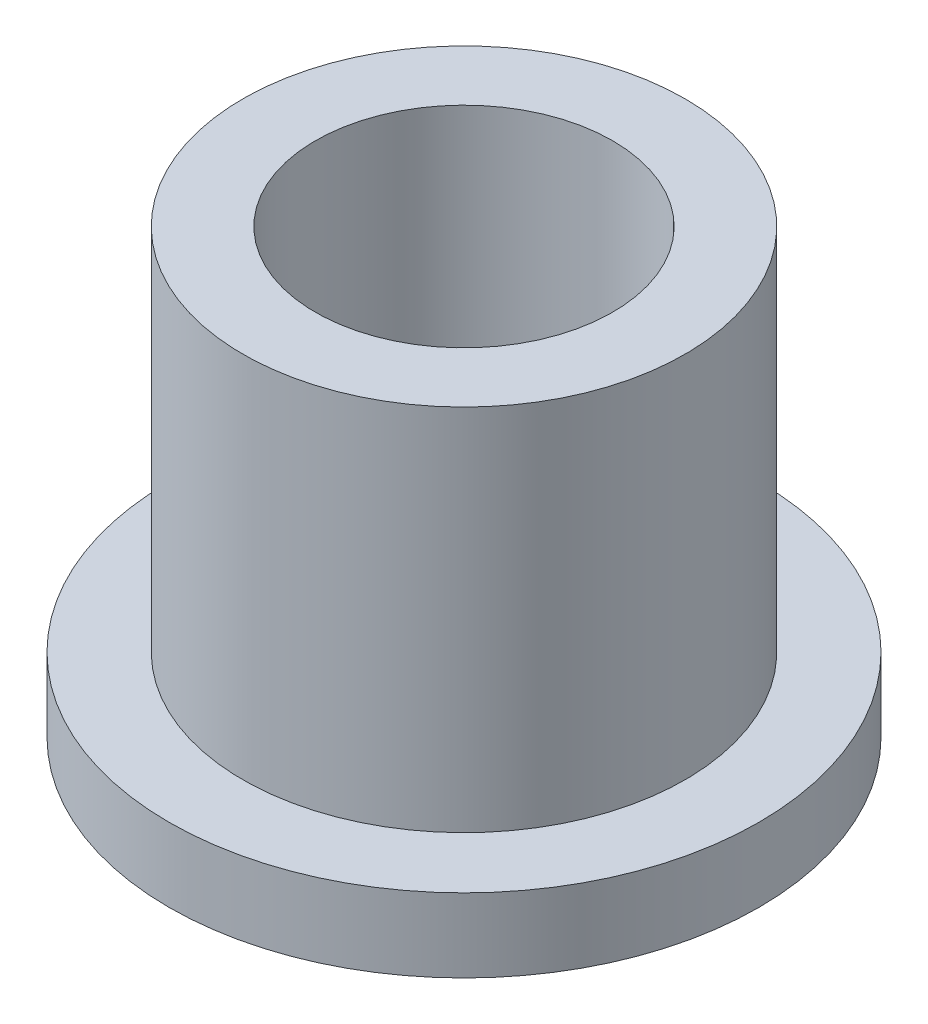
ISO-10303-21;
HEADER;
FILE_DESCRIPTION(('STEP AP214'),'2;1');
FILE_NAME('part.step','',(''),(''),'','','');
FILE_SCHEMA(('AUTOMOTIVE_DESIGN { 1 0 10303 214 1 1 1 1 }'));
ENDSEC;
DATA;
#1=APPLICATION_CONTEXT('core data for automotive mechanical design processes');
#2=APPLICATION_PROTOCOL_DEFINITION('international standard','automotive_design',2000,#1);
#3=PRODUCT_CONTEXT('',#1,'mechanical');
#4=PRODUCT('Part','Part','',(#3));
#5=PRODUCT_RELATED_PRODUCT_CATEGORY('part','',(#4));
#6=PRODUCT_DEFINITION_FORMATION('','',#4);
#7=PRODUCT_DEFINITION_CONTEXT('part definition',#1,'design');
#8=PRODUCT_DEFINITION('design','',#6,#7);
#9=PRODUCT_DEFINITION_SHAPE('','',#8);
#10=(LENGTH_UNIT() NAMED_UNIT(*) SI_UNIT(.MILLI.,.METRE.));
#11=(NAMED_UNIT(*) PLANE_ANGLE_UNIT() SI_UNIT($,.RADIAN.));
#12=(NAMED_UNIT(*) SI_UNIT($,.STERADIAN.) SOLID_ANGLE_UNIT());
#13=UNCERTAINTY_MEASURE_WITH_UNIT(LENGTH_MEASURE(1.E-05),#10,'distance_accuracy_value','');
#14=(GEOMETRIC_REPRESENTATION_CONTEXT(3) GLOBAL_UNCERTAINTY_ASSIGNED_CONTEXT((#13)) GLOBAL_UNIT_ASSIGNED_CONTEXT((#10,
#11,#12)) REPRESENTATION_CONTEXT('',''));
#15=CARTESIAN_POINT('',(0.,0.,0.));
#16=DIRECTION('',(0.,0.,1.));
#17=DIRECTION('',(1.,0.,0.));
#18=AXIS2_PLACEMENT_3D('',#15,#16,#17);
#19=CARTESIAN_POINT('',(0.,19.05,0.));
#20=DIRECTION('',(0.,1.,0.));
#21=DIRECTION('',(0.,0.,0.999999999999999));
#22=AXIS2_PLACEMENT_3D('',#19,#20,#21);
#23=PLANE('',#22);
#24=CARTESIAN_POINT('',(0.,19.05,0.));
#25=DIRECTION('',(0.,1.,0.));
#26=DIRECTION('',(0.,0.,0.999999999999999));
#27=AXIS2_PLACEMENT_3D('',#24,#25,#26);
#28=CIRCLE('',#27,9.525);
#29=CARTESIAN_POINT('',(0.,19.05,-9.52500000000006));
#30=VERTEX_POINT('',#29);
#31=EDGE_CURVE('E12',#30,#30,#28,.T.);
#32=ORIENTED_EDGE('',*,*,#31,.T.);
#33=EDGE_LOOP('',(#32));
#34=FACE_BOUND('',#33,.T.);
#35=CARTESIAN_POINT('',(0.,19.05,0.));
#36=DIRECTION('',(0.,1.,0.));
#37=DIRECTION('',(0.,0.,0.999999999999999));
#38=AXIS2_PLACEMENT_3D('',#35,#36,#37);
#39=CIRCLE('',#38,6.4008);
#40=CARTESIAN_POINT('',(0.,19.05,-6.40080000000007));
#41=VERTEX_POINT('',#40);
#42=EDGE_CURVE('E56',#41,#41,#39,.T.);
#43=ORIENTED_EDGE('',*,*,#42,.F.);
#44=EDGE_LOOP('',(#43));
#45=FACE_BOUND('',#44,.T.);
#46=ADVANCED_FACE('F49',(#34,#45),#23,.T.);
#47=CARTESIAN_POINT('',(0.,0.,0.));
#48=DIRECTION('',(0.,1.,0.));
#49=DIRECTION('',(0.,0.,0.999999999999999));
#50=AXIS2_PLACEMENT_3D('',#47,#48,#49);
#51=PLANE('',#50);
#52=CARTESIAN_POINT('',(0.,0.,0.));
#53=DIRECTION('',(0.,1.,0.));
#54=DIRECTION('',(0.,0.,0.999999999999999));
#55=AXIS2_PLACEMENT_3D('',#52,#53,#54);
#56=CIRCLE('',#55,6.4008);
#57=CARTESIAN_POINT('',(0.,0.,-6.40080000000007));
#58=VERTEX_POINT('',#57);
#59=EDGE_CURVE('E60',#58,#58,#56,.T.);
#60=ORIENTED_EDGE('',*,*,#59,.T.);
#61=EDGE_LOOP('',(#60));
#62=FACE_BOUND('',#61,.T.);
#63=CARTESIAN_POINT('',(0.,0.,0.));
#64=DIRECTION('',(0.,1.,0.));
#65=DIRECTION('',(0.,0.,0.999999999999999));
#66=AXIS2_PLACEMENT_3D('',#63,#64,#65);
#67=CIRCLE('',#66,12.7);
#68=CARTESIAN_POINT('',(0.,0.,12.7));
#69=VERTEX_POINT('',#68);
#70=EDGE_CURVE('E67',#69,#69,#67,.T.);
#71=ORIENTED_EDGE('',*,*,#70,.F.);
#72=EDGE_LOOP('',(#71));
#73=FACE_BOUND('',#72,.T.);
#74=ADVANCED_FACE('F92',(#62,#73),#51,.F.);
#75=CARTESIAN_POINT('',(0.,19.05,0.));
#76=DIRECTION('',(0.,-1.,0.));
#77=DIRECTION('',(0.,0.,-0.999999999999999));
#78=AXIS2_PLACEMENT_3D('',#75,#76,#77);
#79=CYLINDRICAL_SURFACE('',#78,9.525);
#80=CARTESIAN_POINT('',(0.,3.175,0.));
#81=DIRECTION('',(0.,1.,0.));
#82=DIRECTION('',(0.,0.,0.999999999999999));
#83=AXIS2_PLACEMENT_3D('',#80,#81,#82);
#84=CIRCLE('',#83,9.525);
#85=CARTESIAN_POINT('',(0.,3.17499999999999,-9.52500000000006));
#86=VERTEX_POINT('',#85);
#87=EDGE_CURVE('E70',#86,#86,#84,.T.);
#88=CARTESIAN_POINT('',(0.,3.17499999999999,-9.52500000000006));
#89=CARTESIAN_POINT('',(0.,3.34036458333333,-9.52500000000006));
#90=CARTESIAN_POINT('',(0.,3.50572916666666,-9.52500000000006));
#91=CARTESIAN_POINT('',(0.,3.83645833333333,-9.52500000000006));
#92=CARTESIAN_POINT('',(0.,4.00182291666666,-9.52500000000006));
#93=CARTESIAN_POINT('',(0.,4.33255208333333,-9.52500000000006));
#94=CARTESIAN_POINT('',(0.,4.49791666666666,-9.52500000000006));
#95=CARTESIAN_POINT('',(0.,4.82864583333333,-9.52500000000006));
#96=CARTESIAN_POINT('',(0.,4.99401041666666,-9.52500000000006));
#97=CARTESIAN_POINT('',(0.,5.32473958333333,-9.52500000000006));
#98=CARTESIAN_POINT('',(0.,5.49010416666666,-9.52500000000006));
#99=CARTESIAN_POINT('',(0.,5.82083333333333,-9.52500000000006));
#100=CARTESIAN_POINT('',(0.,5.98619791666666,-9.52500000000006));
#101=CARTESIAN_POINT('',(0.,6.31692708333333,-9.52500000000006));
#102=CARTESIAN_POINT('',(0.,6.48229166666666,-9.52500000000006));
#103=CARTESIAN_POINT('',(0.,6.81302083333333,-9.52500000000006));
#104=CARTESIAN_POINT('',(0.,6.97838541666666,-9.52500000000006));
#105=CARTESIAN_POINT('',(0.,7.30911458333333,-9.52500000000006));
#106=CARTESIAN_POINT('',(0.,7.47447916666667,-9.52500000000006));
#107=CARTESIAN_POINT('',(0.,7.80520833333333,-9.52500000000006));
#108=CARTESIAN_POINT('',(0.,7.97057291666667,-9.52500000000006));
#109=CARTESIAN_POINT('',(0.,8.30130208333333,-9.52500000000006));
#110=CARTESIAN_POINT('',(0.,8.46666666666667,-9.52500000000006));
#111=CARTESIAN_POINT('',(0.,8.79739583333333,-9.52500000000006));
#112=CARTESIAN_POINT('',(0.,8.96276041666667,-9.52500000000006));
#113=CARTESIAN_POINT('',(0.,9.29348958333333,-9.52500000000006));
#114=CARTESIAN_POINT('',(0.,9.45885416666667,-9.52500000000006));
#115=CARTESIAN_POINT('',(0.,9.78958333333333,-9.52500000000006));
#116=CARTESIAN_POINT('',(0.,9.95494791666667,-9.52500000000006));
#117=CARTESIAN_POINT('',(0.,10.2856770833333,-9.52500000000006));
#118=CARTESIAN_POINT('',(0.,10.4510416666667,-9.52500000000006));
#119=CARTESIAN_POINT('',(0.,10.7817708333333,-9.52500000000006));
#120=CARTESIAN_POINT('',(0.,10.9471354166667,-9.52500000000006));
#121=CARTESIAN_POINT('',(0.,11.2778645833333,-9.52500000000006));
#122=CARTESIAN_POINT('',(0.,11.4432291666667,-9.52500000000006));
#123=CARTESIAN_POINT('',(0.,11.7739583333333,-9.52500000000006));
#124=CARTESIAN_POINT('',(0.,11.9393229166667,-9.52500000000006));
#125=CARTESIAN_POINT('',(0.,12.2700520833333,-9.52500000000006));
#126=CARTESIAN_POINT('',(0.,12.4354166666667,-9.52500000000006));
#127=CARTESIAN_POINT('',(0.,12.7661458333333,-9.52500000000006));
#128=CARTESIAN_POINT('',(0.,12.9315104166667,-9.52500000000006));
#129=CARTESIAN_POINT('',(0.,13.2622395833333,-9.52500000000006));
#130=CARTESIAN_POINT('',(0.,13.4276041666667,-9.52500000000006));
#131=CARTESIAN_POINT('',(0.,13.7583333333333,-9.52500000000006));
#132=CARTESIAN_POINT('',(0.,13.9236979166667,-9.52500000000006));
#133=CARTESIAN_POINT('',(0.,14.2544270833333,-9.52500000000006));
#134=CARTESIAN_POINT('',(0.,14.4197916666667,-9.52500000000006));
#135=CARTESIAN_POINT('',(0.,14.7505208333333,-9.52500000000006));
#136=CARTESIAN_POINT('',(0.,14.9158854166667,-9.52500000000006));
#137=CARTESIAN_POINT('',(0.,15.2466145833333,-9.52500000000006));
#138=CARTESIAN_POINT('',(0.,15.4119791666667,-9.52500000000006));
#139=CARTESIAN_POINT('',(0.,15.7427083333333,-9.52500000000006));
#140=CARTESIAN_POINT('',(0.,15.9080729166667,-9.52500000000006));
#141=CARTESIAN_POINT('',(0.,16.2388020833333,-9.52500000000006));
#142=CARTESIAN_POINT('',(0.,16.4041666666667,-9.52500000000006));
#143=CARTESIAN_POINT('',(0.,16.7348958333333,-9.52500000000006));
#144=CARTESIAN_POINT('',(0.,16.9002604166667,-9.52500000000006));
#145=CARTESIAN_POINT('',(0.,17.2309895833333,-9.52500000000006));
#146=CARTESIAN_POINT('',(0.,17.3963541666667,-9.52500000000006));
#147=CARTESIAN_POINT('',(0.,17.7270833333333,-9.52500000000006));
#148=CARTESIAN_POINT('',(0.,17.8924479166667,-9.52500000000006));
#149=CARTESIAN_POINT('',(0.,18.2231770833333,-9.52500000000006));
#150=CARTESIAN_POINT('',(0.,18.3885416666667,-9.52500000000006));
#151=CARTESIAN_POINT('',(0.,18.7192708333333,-9.52500000000006));
#152=CARTESIAN_POINT('',(0.,18.8846354166667,-9.52500000000006));
#153=CARTESIAN_POINT('',(0.,19.05,-9.52500000000006));
#154=B_SPLINE_CURVE_WITH_KNOTS('',3,(#88,#89,#90,#91,#92,#93,#94,#95,#96,#97,#98,#99,#100,#101,
#102,#103,#104,#105,#106,#107,#108,#109,#110,#111,#112,#113,#114,#115,#116,#117,#118,#119,#120,
#121,#122,#123,#124,#125,#126,#127,#128,#129,#130,#131,#132,#133,#134,#135,#136,#137,#138,#139,
#140,#141,#142,#143,#144,#145,#146,#147,#148,#149,#150,#151,#152,#153),.UNSPECIFIED.,.F.,.F.,(4,
2,2,2,2,2,2,2,2,2,2,2,2,2,2,2,2,2,2,2,2,2,2,2,2,2,2,2,2,2,2,2,4),(0.,0.496093749999999,
0.9921875,1.48828125,1.984375,2.48046875,2.9765625,3.47265625,3.96875,4.46484375,
4.96093750000001,5.45703125000001,5.95312500000001,6.44921875000001,6.94531250000001,
7.44140625000001,7.93750000000001,8.43359375000001,8.92968750000001,9.42578125000001,
9.92187500000001,10.41796875,10.9140625,11.41015625,11.90625,12.40234375,12.8984375,13.39453125,
13.890625,14.38671875,14.8828125,15.37890625,15.875),.UNSPECIFIED.);
#155=EDGE_CURVE('BSEAM51',#86,#30,#154,.T.);
#156=ORIENTED_EDGE('',*,*,#87,.T.);
#157=ORIENTED_EDGE('',*,*,#31,.F.);
#158=ORIENTED_EDGE('',*,*,#155,.T.);
#159=ORIENTED_EDGE('',*,*,#155,.F.);
#160=EDGE_LOOP('',(#156,#158,#157,#159));
#161=FACE_BOUND('',#160,.T.);
#162=ADVANCED_FACE('F51',(#161),#79,.T.);
#163=CARTESIAN_POINT('',(0.,19.05,0.));
#164=DIRECTION('',(0.,-1.,0.));
#165=DIRECTION('',(0.,0.,-0.999999999999999));
#166=AXIS2_PLACEMENT_3D('',#163,#164,#165);
#167=CYLINDRICAL_SURFACE('',#166,6.4008);
#168=CARTESIAN_POINT('',(0.,19.05,-6.40080000000007));
#169=CARTESIAN_POINT('',(0.,18.8515625,-6.40080000000007));
#170=CARTESIAN_POINT('',(0.,18.653125,-6.40080000000007));
#171=CARTESIAN_POINT('',(0.,18.25625,-6.40080000000007));
#172=CARTESIAN_POINT('',(0.,18.0578125,-6.40080000000007));
#173=CARTESIAN_POINT('',(0.,17.6609375,-6.40080000000007));
#174=CARTESIAN_POINT('',(0.,17.4625,-6.40080000000007));
#175=CARTESIAN_POINT('',(0.,17.065625,-6.40080000000007));
#176=CARTESIAN_POINT('',(0.,16.8671875,-6.40080000000007));
#177=CARTESIAN_POINT('',(0.,16.4703125,-6.40080000000007));
#178=CARTESIAN_POINT('',(0.,16.271875,-6.40080000000007));
#179=CARTESIAN_POINT('',(0.,15.875,-6.40080000000007));
#180=CARTESIAN_POINT('',(0.,15.6765625,-6.40080000000007));
#181=CARTESIAN_POINT('',(0.,15.2796875,-6.40080000000007));
#182=CARTESIAN_POINT('',(0.,15.08125,-6.40080000000007));
#183=CARTESIAN_POINT('',(0.,14.684375,-6.40080000000007));
#184=CARTESIAN_POINT('',(0.,14.4859375,-6.40080000000007));
#185=CARTESIAN_POINT('',(0.,14.0890625,-6.40080000000007));
#186=CARTESIAN_POINT('',(0.,13.890625,-6.40080000000007));
#187=CARTESIAN_POINT('',(0.,13.49375,-6.40080000000007));
#188=CARTESIAN_POINT('',(0.,13.2953125,-6.40080000000007));
#189=CARTESIAN_POINT('',(0.,12.8984375,-6.40080000000007));
#190=CARTESIAN_POINT('',(0.,12.7,-6.40080000000007));
#191=CARTESIAN_POINT('',(0.,12.303125,-6.40080000000007));
#192=CARTESIAN_POINT('',(0.,12.1046875,-6.40080000000007));
#193=CARTESIAN_POINT('',(0.,11.7078125,-6.40080000000007));
#194=CARTESIAN_POINT('',(0.,11.509375,-6.40080000000007));
#195=CARTESIAN_POINT('',(0.,11.1125,-6.40080000000007));
#196=CARTESIAN_POINT('',(0.,10.9140625,-6.40080000000007));
#197=CARTESIAN_POINT('',(0.,10.5171875,-6.40080000000007));
#198=CARTESIAN_POINT('',(0.,10.31875,-6.40080000000007));
#199=CARTESIAN_POINT('',(0.,9.921875,-6.40080000000007));
#200=CARTESIAN_POINT('',(0.,9.7234375,-6.40080000000007));
#201=CARTESIAN_POINT('',(0.,9.3265625,-6.40080000000007));
#202=CARTESIAN_POINT('',(0.,9.128125,-6.40080000000007));
#203=CARTESIAN_POINT('',(0.,8.73125,-6.40080000000007));
#204=CARTESIAN_POINT('',(0.,8.5328125,-6.40080000000007));
#205=CARTESIAN_POINT('',(0.,8.1359375,-6.40080000000007));
#206=CARTESIAN_POINT('',(0.,7.9375,-6.40080000000007));
#207=CARTESIAN_POINT('',(0.,7.540625,-6.40080000000007));
#208=CARTESIAN_POINT('',(0.,7.3421875,-6.40080000000007));
#209=CARTESIAN_POINT('',(0.,6.9453125,-6.40080000000007));
#210=CARTESIAN_POINT('',(0.,6.746875,-6.40080000000007));
#211=CARTESIAN_POINT('',(0.,6.35,-6.40080000000007));
#212=CARTESIAN_POINT('',(0.,6.1515625,-6.40080000000007));
#213=CARTESIAN_POINT('',(0.,5.7546875,-6.40080000000007));
#214=CARTESIAN_POINT('',(0.,5.55625,-6.40080000000007));
#215=CARTESIAN_POINT('',(0.,5.159375,-6.40080000000007));
#216=CARTESIAN_POINT('',(0.,4.9609375,-6.40080000000007));
#217=CARTESIAN_POINT('',(0.,4.5640625,-6.40080000000007));
#218=CARTESIAN_POINT('',(0.,4.365625,-6.40080000000007));
#219=CARTESIAN_POINT('',(0.,3.96875,-6.40080000000007));
#220=CARTESIAN_POINT('',(0.,3.7703125,-6.40080000000007));
#221=CARTESIAN_POINT('',(0.,3.3734375,-6.40080000000007));
#222=CARTESIAN_POINT('',(0.,3.175,-6.40080000000007));
#223=CARTESIAN_POINT('',(0.,2.778125,-6.40080000000007));
#224=CARTESIAN_POINT('',(0.,2.5796875,-6.40080000000007));
#225=CARTESIAN_POINT('',(0.,2.1828125,-6.40080000000007));
#226=CARTESIAN_POINT('',(0.,1.984375,-6.40080000000007));
#227=CARTESIAN_POINT('',(0.,1.5875,-6.40080000000007));
#228=CARTESIAN_POINT('',(0.,1.3890625,-6.40080000000007));
#229=CARTESIAN_POINT('',(0.,0.992187499999997,-6.40080000000007));
#230=CARTESIAN_POINT('',(0.,0.793749999999997,-6.40080000000007));
#231=CARTESIAN_POINT('',(0.,0.396874999999997,-6.40080000000007));
#232=CARTESIAN_POINT('',(0.,0.198437499999997,-6.40080000000007));
#233=CARTESIAN_POINT('',(0.,0.,-6.40080000000007));
#234=B_SPLINE_CURVE_WITH_KNOTS('',3,(#168,#169,#170,#171,#172,#173,#174,#175,#176,#177,#178,
#179,#180,#181,#182,#183,#184,#185,#186,#187,#188,#189,#190,#191,#192,#193,#194,#195,#196,#197,
#198,#199,#200,#201,#202,#203,#204,#205,#206,#207,#208,#209,#210,#211,#212,#213,#214,#215,#216,
#217,#218,#219,#220,#221,#222,#223,#224,#225,#226,#227,#228,#229,#230,#231,#232,#233),
.UNSPECIFIED.,.F.,.F.,(4,2,2,2,2,2,2,2,2,2,2,2,2,2,2,2,2,2,2,2,2,2,2,2,2,2,2,2,2,2,2,2,4),(0.,
0.595312499999997,1.190625,1.7859375,2.38125,2.9765625,3.571875,4.1671875,4.7625,5.3578125,
5.953125,6.5484375,7.14375,7.7390625,8.334375,8.9296875,9.525,10.1203125,10.715625,11.3109375,
11.90625,12.5015625,13.096875,13.6921875,14.2875,14.8828125,15.478125,16.0734375,16.66875,
17.2640625,17.859375,18.4546875,19.05),.UNSPECIFIED.);
#235=EDGE_CURVE('BSEAM81',#41,#58,#234,.T.);
#236=ORIENTED_EDGE('',*,*,#42,.T.);
#237=ORIENTED_EDGE('',*,*,#59,.F.);
#238=ORIENTED_EDGE('',*,*,#235,.T.);
#239=ORIENTED_EDGE('',*,*,#235,.F.);
#240=EDGE_LOOP('',(#236,#238,#237,#239));
#241=FACE_BOUND('',#240,.T.);
#242=ADVANCED_FACE('F81',(#241),#167,.F.);
#243=CARTESIAN_POINT('',(0.,3.175,0.));
#244=DIRECTION('',(0.,1.,0.));
#245=DIRECTION('',(0.,0.,0.999999999999999));
#246=AXIS2_PLACEMENT_3D('',#243,#244,#245);
#247=PLANE('',#246);
#248=CARTESIAN_POINT('',(0.,3.175,0.));
#249=DIRECTION('',(0.,1.,0.));
#250=DIRECTION('',(0.,0.,0.999999999999999));
#251=AXIS2_PLACEMENT_3D('',#248,#249,#250);
#252=CIRCLE('',#251,12.7);
#253=CARTESIAN_POINT('',(0.,3.175,12.6999999999999));
#254=VERTEX_POINT('',#253);
#255=EDGE_CURVE('E65',#254,#254,#252,.T.);
#256=ORIENTED_EDGE('',*,*,#255,.T.);
#257=EDGE_LOOP('',(#256));
#258=FACE_BOUND('',#257,.T.);
#259=ORIENTED_EDGE('',*,*,#87,.F.);
#260=EDGE_LOOP('',(#259));
#261=FACE_BOUND('',#260,.T.);
#262=ADVANCED_FACE('F78',(#258,#261),#247,.T.);
#263=CARTESIAN_POINT('',(0.,3.175,0.));
#264=DIRECTION('',(0.,-1.,0.));
#265=DIRECTION('',(0.,0.,-0.999999999999999));
#266=AXIS2_PLACEMENT_3D('',#263,#264,#265);
#267=CYLINDRICAL_SURFACE('',#266,12.7);
#268=ORIENTED_EDGE('',*,*,#255,.F.);
#269=EDGE_LOOP('',(#268));
#270=FACE_BOUND('',#269,.T.);
#271=ORIENTED_EDGE('',*,*,#70,.T.);
#272=EDGE_LOOP('',(#271));
#273=FACE_BOUND('',#272,.T.);
#274=ADVANCED_FACE('F80',(#270,#273),#267,.T.);
#275=CLOSED_SHELL('',(#46,#74,#162,#242,#262,#274));
#276=MANIFOLD_SOLID_BREP('B2',#275);
#277=ADVANCED_BREP_SHAPE_REPRESENTATION('',(#18,#276),#14);
#278=SHAPE_DEFINITION_REPRESENTATION(#9,#277);
ENDSEC;
END-ISO-10303-21;
